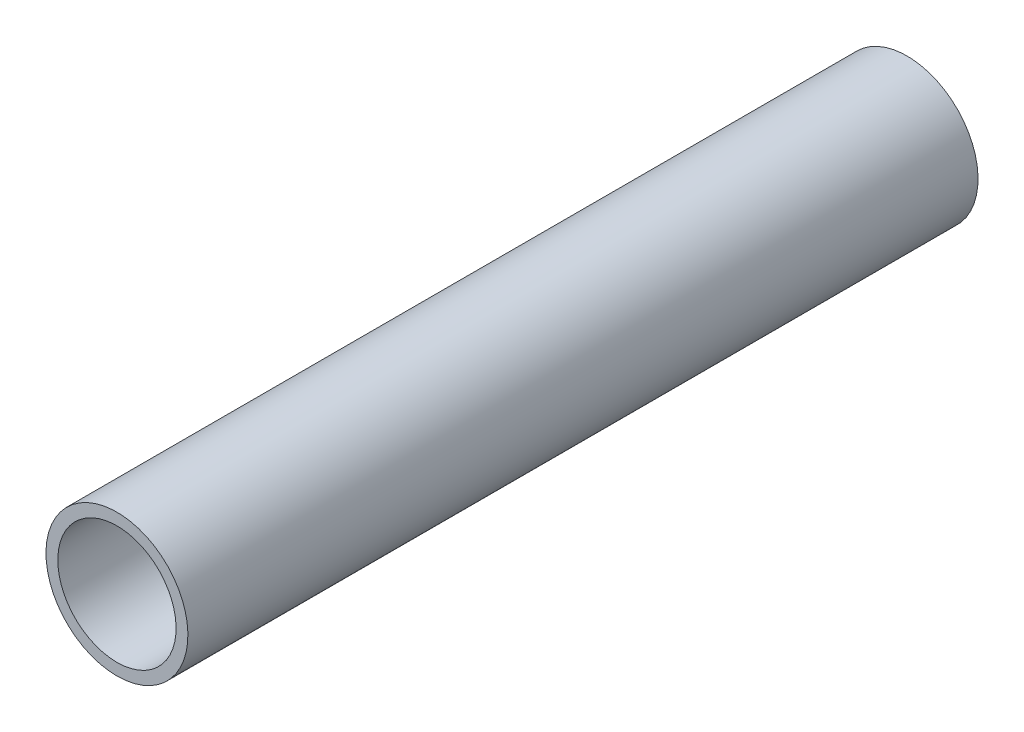
ISO-10303-21;
HEADER;
FILE_DESCRIPTION(('STEP AP214'),'2;1');
FILE_NAME('part.step','',(''),(''),'','','');
FILE_SCHEMA(('AUTOMOTIVE_DESIGN { 1 0 10303 214 1 1 1 1 }'));
ENDSEC;
DATA;
#1=APPLICATION_CONTEXT('core data for automotive mechanical design processes');
#2=APPLICATION_PROTOCOL_DEFINITION('international standard','automotive_design',2000,#1);
#3=PRODUCT_CONTEXT('',#1,'mechanical');
#4=PRODUCT('Part','Part','',(#3));
#5=PRODUCT_RELATED_PRODUCT_CATEGORY('part','',(#4));
#6=PRODUCT_DEFINITION_FORMATION('','',#4);
#7=PRODUCT_DEFINITION_CONTEXT('part definition',#1,'design');
#8=PRODUCT_DEFINITION('design','',#6,#7);
#9=PRODUCT_DEFINITION_SHAPE('','',#8);
#10=(LENGTH_UNIT() NAMED_UNIT(*) SI_UNIT(.MILLI.,.METRE.));
#11=(NAMED_UNIT(*) PLANE_ANGLE_UNIT() SI_UNIT($,.RADIAN.));
#12=(NAMED_UNIT(*) SI_UNIT($,.STERADIAN.) SOLID_ANGLE_UNIT());
#13=UNCERTAINTY_MEASURE_WITH_UNIT(LENGTH_MEASURE(1.E-05),#10,'distance_accuracy_value','');
#14=(GEOMETRIC_REPRESENTATION_CONTEXT(3) GLOBAL_UNCERTAINTY_ASSIGNED_CONTEXT((#13)) GLOBAL_UNIT_ASSIGNED_CONTEXT((#10,
#11,#12)) REPRESENTATION_CONTEXT('',''));
#15=CARTESIAN_POINT('',(0.,0.,0.));
#16=DIRECTION('',(0.,0.,1.));
#17=DIRECTION('',(1.,0.,0.));
#18=AXIS2_PLACEMENT_3D('',#15,#16,#17);
#19=CARTESIAN_POINT('',(104.782499,-67.53,-0.045));
#20=DIRECTION('',(0.,0.,-1.));
#21=DIRECTION('',(0.,-1.,0.));
#22=AXIS2_PLACEMENT_3D('',#19,#20,#21);
#23=CYLINDRICAL_SURFACE('',#22,0.125);
#24=CARTESIAN_POINT('',(104.782499,-67.53,-0.035));
#25=DIRECTION('',(0.,0.,-1.));
#26=DIRECTION('',(0.,-1.,0.));
#27=AXIS2_PLACEMENT_3D('',#24,#25,#26);
#28=CIRCLE('',#27,0.125);
#29=CARTESIAN_POINT('',(104.782499,-67.655,-0.035));
#30=VERTEX_POINT('',#29);
#31=EDGE_CURVE('E63',#30,#30,#28,.T.);
#32=ORIENTED_EDGE('',*,*,#31,.T.);
#33=DIRECTION('',(0.,0.,1.));
#34=VECTOR('',#33,1.);
#35=CARTESIAN_POINT('',(104.782499,-67.655,-0.045));
#36=LINE('',#35,#34);
#37=CARTESIAN_POINT('',(104.782499,-67.655,1.635));
#38=VERTEX_POINT('',#37);
#39=EDGE_CURVE('E11',#30,#38,#36,.T.);
#40=ORIENTED_EDGE('',*,*,#39,.T.);
#41=CARTESIAN_POINT('',(104.782499,-67.53,1.635));
#42=DIRECTION('',(0.,0.,-1.));
#43=DIRECTION('',(0.,-1.,0.));
#44=AXIS2_PLACEMENT_3D('',#41,#42,#43);
#45=CIRCLE('',#44,0.125);
#46=EDGE_CURVE('E25',#38,#38,#45,.T.);
#47=ORIENTED_EDGE('',*,*,#46,.F.);
#48=ORIENTED_EDGE('',*,*,#39,.F.);
#49=EDGE_LOOP('',(#32,#40,#47,#48));
#50=FACE_BOUND('',#49,.T.);
#51=ADVANCED_FACE('F17',(#50),#23,.F.);
#52=CARTESIAN_POINT('',(104.782499,-67.68,1.635));
#53=DIRECTION('',(0.,0.,1.));
#54=DIRECTION('',(1.,0.,0.));
#55=AXIS2_PLACEMENT_3D('',#52,#53,#54);
#56=PLANE('',#55);
#57=ORIENTED_EDGE('',*,*,#46,.T.);
#58=EDGE_LOOP('',(#57));
#59=FACE_BOUND('',#58,.T.);
#60=CARTESIAN_POINT('',(104.782499,-67.53,1.635));
#61=DIRECTION('',(0.,0.,1.));
#62=DIRECTION('',(0.,-1.,0.));
#63=AXIS2_PLACEMENT_3D('',#60,#61,#62);
#64=CIRCLE('',#63,0.15);
#65=CARTESIAN_POINT('',(104.782499,-67.68,1.635));
#66=VERTEX_POINT('',#65);
#67=EDGE_CURVE('E55',#66,#66,#64,.T.);
#68=ORIENTED_EDGE('',*,*,#67,.T.);
#69=EDGE_LOOP('',(#68));
#70=FACE_BOUND('',#69,.T.);
#71=ADVANCED_FACE('F72',(#59,#70),#56,.T.);
#72=CARTESIAN_POINT('',(104.782499,-67.68,-0.035));
#73=DIRECTION('',(0.,0.,1.));
#74=DIRECTION('',(1.,0.,0.));
#75=AXIS2_PLACEMENT_3D('',#72,#73,#74);
#76=PLANE('',#75);
#77=ORIENTED_EDGE('',*,*,#31,.F.);
#78=EDGE_LOOP('',(#77));
#79=FACE_BOUND('',#78,.T.);
#80=CARTESIAN_POINT('',(104.782499,-67.53,-0.035));
#81=DIRECTION('',(0.,0.,1.));
#82=DIRECTION('',(0.,-1.,0.));
#83=AXIS2_PLACEMENT_3D('',#80,#81,#82);
#84=CIRCLE('',#83,0.15);
#85=CARTESIAN_POINT('',(104.782499,-67.68,-0.035));
#86=VERTEX_POINT('',#85);
#87=EDGE_CURVE('E54',#86,#86,#84,.T.);
#88=ORIENTED_EDGE('',*,*,#87,.F.);
#89=EDGE_LOOP('',(#88));
#90=FACE_BOUND('',#89,.T.);
#91=ADVANCED_FACE('F81',(#79,#90),#76,.F.);
#92=CARTESIAN_POINT('',(104.782499,-67.53,-0.035));
#93=DIRECTION('',(0.,0.,-1.));
#94=DIRECTION('',(0.,-1.,0.));
#95=AXIS2_PLACEMENT_3D('',#92,#93,#94);
#96=CYLINDRICAL_SURFACE('',#95,0.15);
#97=ORIENTED_EDGE('',*,*,#87,.T.);
#98=DIRECTION('',(0.,0.,1.));
#99=VECTOR('',#98,1.);
#100=CARTESIAN_POINT('',(104.782499,-67.68,-0.035));
#101=LINE('',#100,#99);
#102=EDGE_CURVE('E51',#86,#66,#101,.T.);
#103=ORIENTED_EDGE('',*,*,#102,.T.);
#104=ORIENTED_EDGE('',*,*,#67,.F.);
#105=ORIENTED_EDGE('',*,*,#102,.F.);
#106=EDGE_LOOP('',(#97,#103,#104,#105));
#107=FACE_BOUND('',#106,.T.);
#108=ADVANCED_FACE('F52',(#107),#96,.T.);
#109=CLOSED_SHELL('',(#51,#71,#91,#108));
#110=MANIFOLD_SOLID_BREP('B1',#109);
#111=ADVANCED_BREP_SHAPE_REPRESENTATION('',(#18,#110),#14);
#112=SHAPE_DEFINITION_REPRESENTATION(#9,#111);
ENDSEC;
END-ISO-10303-21;
